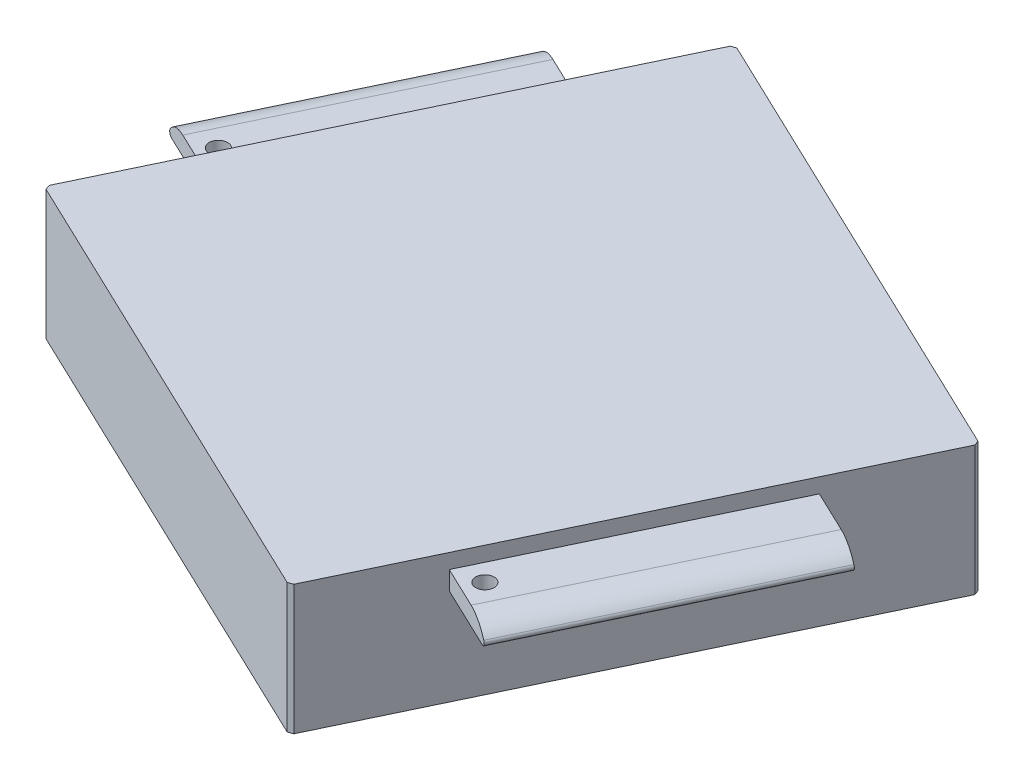
ISO-10303-21;
HEADER;
FILE_DESCRIPTION(('STEP AP214'),'2;1');
FILE_NAME('part.step','',(''),(''),'','','');
FILE_SCHEMA(('AUTOMOTIVE_DESIGN { 1 0 10303 214 1 1 1 1 }'));
ENDSEC;
DATA;
#1=APPLICATION_CONTEXT('core data for automotive mechanical design processes');
#2=APPLICATION_PROTOCOL_DEFINITION('international standard','automotive_design',2000,#1);
#3=PRODUCT_CONTEXT('',#1,'mechanical');
#4=PRODUCT('Part','Part','',(#3));
#5=PRODUCT_RELATED_PRODUCT_CATEGORY('part','',(#4));
#6=PRODUCT_DEFINITION_FORMATION('','',#4);
#7=PRODUCT_DEFINITION_CONTEXT('part definition',#1,'design');
#8=PRODUCT_DEFINITION('design','',#6,#7);
#9=PRODUCT_DEFINITION_SHAPE('','',#8);
#10=(LENGTH_UNIT() NAMED_UNIT(*) SI_UNIT(.MILLI.,.METRE.));
#11=(NAMED_UNIT(*) PLANE_ANGLE_UNIT() SI_UNIT($,.RADIAN.));
#12=(NAMED_UNIT(*) SI_UNIT($,.STERADIAN.) SOLID_ANGLE_UNIT());
#13=UNCERTAINTY_MEASURE_WITH_UNIT(LENGTH_MEASURE(1.E-05),#10,'distance_accuracy_value','');
#14=(GEOMETRIC_REPRESENTATION_CONTEXT(3) GLOBAL_UNCERTAINTY_ASSIGNED_CONTEXT((#13)) GLOBAL_UNIT_ASSIGNED_CONTEXT((#10,
#11,#12)) REPRESENTATION_CONTEXT('',''));
#15=CARTESIAN_POINT('',(0.,0.,0.));
#16=DIRECTION('',(0.,0.,1.));
#17=DIRECTION('',(1.,0.,0.));
#18=AXIS2_PLACEMENT_3D('',#15,#16,#17);
#19=CARTESIAN_POINT('',(29.8578123017319,940.,-1811.82868703004));
#20=DIRECTION('',(-0.902585284349861,0.,-0.430511096808295));
#21=DIRECTION('',(-0.430511096808295,0.,0.902585284349861));
#22=AXIS2_PLACEMENT_3D('',#19,#20,#21);
#23=PLANE('',#22);
#24=DIRECTION('',(0.430511096808295,0.,-0.902585284349861));
#25=VECTOR('',#24,1.);
#26=CARTESIAN_POINT('',(29.8578123017319,870.,-1811.82868703004));
#27=LINE('',#26,#25);
#28=CARTESIAN_POINT('',(29.8578123017319,870.,-1811.82868703004));
#29=VERTEX_POINT('',#28);
#30=CARTESIAN_POINT('',(148.678875020821,870.,-2060.9422255106));
#31=VERTEX_POINT('',#30);
#32=EDGE_CURVE('E235',#29,#31,#27,.T.);
#33=ORIENTED_EDGE('',*,*,#32,.F.);
#34=DIRECTION('',(0.,-1.,0.));
#35=VECTOR('',#34,1.);
#36=CARTESIAN_POINT('',(29.8578123017319,940.,-1811.82868703004));
#37=LINE('',#36,#35);
#38=CARTESIAN_POINT('',(29.8578123017319,940.,-1811.82868703004));
#39=VERTEX_POINT('',#38);
#40=EDGE_CURVE('E11',#39,#29,#37,.T.);
#41=ORIENTED_EDGE('',*,*,#40,.F.);
#42=DIRECTION('',(0.430511096808295,0.,-0.902585284349861));
#43=VECTOR('',#42,1.);
#44=CARTESIAN_POINT('',(29.8578123017319,940.,-1811.82868703004));
#45=LINE('',#44,#43);
#46=CARTESIAN_POINT('',(148.678875020821,940.,-2060.9422255106));
#47=VERTEX_POINT('',#46);
#48=EDGE_CURVE('E259',#39,#47,#45,.T.);
#49=ORIENTED_EDGE('',*,*,#48,.T.);
#50=DIRECTION('',(0.,-1.,0.));
#51=VECTOR('',#50,1.);
#52=CARTESIAN_POINT('',(148.678875020821,940.,-2060.9422255106));
#53=LINE('',#52,#51);
#54=EDGE_CURVE('E25',#47,#31,#53,.T.);
#55=ORIENTED_EDGE('',*,*,#54,.T.);
#56=EDGE_LOOP('',(#33,#41,#49,#55));
#57=FACE_BOUND('',#56,.T.);
#58=DIRECTION('',(0.430511096808295,0.,-0.90258528434986));
#59=VECTOR('',#58,1.);
#60=CARTESIAN_POINT('',(56.9800114006546,932.,-1868.69155994407));
#61=LINE('',#60,#59);
#62=CARTESIAN_POINT('',(56.9800114006546,932.,-1868.69155994407));
#63=VERTEX_POINT('',#62);
#64=CARTESIAN_POINT('',(121.556675921899,932.,-2004.07935259656));
#65=VERTEX_POINT('',#64);
#66=EDGE_CURVE('E32',#63,#65,#61,.T.);
#67=ORIENTED_EDGE('',*,*,#66,.F.);
#68=DIRECTION('',(0.,-1.,0.));
#69=VECTOR('',#68,1.);
#70=CARTESIAN_POINT('',(56.9800114006546,932.,-1868.69155994407));
#71=LINE('',#70,#69);
#72=CARTESIAN_POINT('',(56.9800114006546,922.,-1868.69155994407));
#73=VERTEX_POINT('',#72);
#74=EDGE_CURVE('E36',#63,#73,#71,.T.);
#75=ORIENTED_EDGE('',*,*,#74,.T.);
#76=DIRECTION('',(0.430511096808295,0.,-0.90258528434986));
#77=VECTOR('',#76,1.);
#78=CARTESIAN_POINT('',(56.9800114006546,922.,-1868.69155994407));
#79=LINE('',#78,#77);
#80=CARTESIAN_POINT('',(121.556675921899,922.,-2004.07935259656));
#81=VERTEX_POINT('',#80);
#82=EDGE_CURVE('E136',#73,#81,#79,.T.);
#83=ORIENTED_EDGE('',*,*,#82,.T.);
#84=DIRECTION('',(0.,-1.,0.));
#85=VECTOR('',#84,1.);
#86=CARTESIAN_POINT('',(121.556675921899,932.,-2004.07935259656));
#87=LINE('',#86,#85);
#88=EDGE_CURVE('E139',#65,#81,#87,.T.);
#89=ORIENTED_EDGE('',*,*,#88,.F.);
#90=EDGE_LOOP('',(#67,#75,#83,#89));
#91=FACE_BOUND('',#90,.T.);
#92=ADVANCED_FACE('F17',(#57,#91),#23,.T.);
#93=CARTESIAN_POINT('',(30.8019606768151,940.,-1809.16249426771));
#94=DIRECTION('',(-0.942641491092178,0.,0.333806859233771));
#95=DIRECTION('',(0.333806859233771,0.,0.942641491092178));
#96=AXIS2_PLACEMENT_3D('',#93,#94,#95);
#97=PLANE('',#96);
#98=DIRECTION('',(-0.333806859233771,0.,-0.942641491092178));
#99=VECTOR('',#98,1.);
#100=CARTESIAN_POINT('',(30.8019606768151,870.,-1809.16249426771));
#101=LINE('',#100,#99);
#102=CARTESIAN_POINT('',(30.8019606768151,870.,-1809.16249426771));
#103=VERTEX_POINT('',#102);
#104=EDGE_CURVE('E232',#103,#29,#101,.T.);
#105=ORIENTED_EDGE('',*,*,#104,.F.);
#106=DIRECTION('',(0.,-1.,0.));
#107=VECTOR('',#106,1.);
#108=CARTESIAN_POINT('',(30.8019606768151,940.,-1809.16249426771));
#109=LINE('',#108,#107);
#110=CARTESIAN_POINT('',(30.8019606768151,940.,-1809.16249426771));
#111=VERTEX_POINT('',#110);
#112=EDGE_CURVE('E280',#111,#103,#109,.T.);
#113=ORIENTED_EDGE('',*,*,#112,.F.);
#114=DIRECTION('',(-0.333806859233771,0.,-0.942641491092178));
#115=VECTOR('',#114,1.);
#116=CARTESIAN_POINT('',(30.8019606768151,940.,-1809.16249426771));
#117=LINE('',#116,#115);
#118=EDGE_CURVE('E256',#111,#39,#117,.T.);
#119=ORIENTED_EDGE('',*,*,#118,.T.);
#120=ORIENTED_EDGE('',*,*,#40,.T.);
#121=EDGE_LOOP('',(#105,#113,#119,#120));
#122=FACE_BOUND('',#121,.T.);
#123=ADVANCED_FACE('F19',(#122),#97,.T.);
#124=CARTESIAN_POINT('',(148.678875020821,940.,-2060.9422255106));
#125=DIRECTION('',(-0.333806859233771,0.,-0.942641491092178));
#126=DIRECTION('',(-0.942641491092178,0.,0.333806859233771));
#127=AXIS2_PLACEMENT_3D('',#124,#125,#126);
#128=PLANE('',#127);
#129=DIRECTION('',(0.942641491092178,0.,-0.333806859233771));
#130=VECTOR('',#129,1.);
#131=CARTESIAN_POINT('',(148.678875020821,870.,-2060.9422255106));
#132=LINE('',#131,#130);
#133=CARTESIAN_POINT('',(151.345067783137,870.,-2061.88637388568));
#134=VERTEX_POINT('',#133);
#135=EDGE_CURVE('E238',#31,#134,#132,.T.);
#136=ORIENTED_EDGE('',*,*,#135,.F.);
#137=ORIENTED_EDGE('',*,*,#54,.F.);
#138=DIRECTION('',(0.942641491092178,0.,-0.333806859233771));
#139=VECTOR('',#138,1.);
#140=CARTESIAN_POINT('',(148.678875020821,940.,-2060.9422255106));
#141=LINE('',#140,#139);
#142=CARTESIAN_POINT('',(151.345067783137,940.,-2061.88637388568));
#143=VERTEX_POINT('',#142);
#144=EDGE_CURVE('E262',#47,#143,#141,.T.);
#145=ORIENTED_EDGE('',*,*,#144,.T.);
#146=DIRECTION('',(0.,-1.,0.));
#147=VECTOR('',#146,1.);
#148=CARTESIAN_POINT('',(151.345067783137,940.,-2061.88637388568));
#149=LINE('',#148,#147);
#150=EDGE_CURVE('E292',#143,#134,#149,.T.);
#151=ORIENTED_EDGE('',*,*,#150,.T.);
#152=EDGE_LOOP('',(#136,#137,#145,#151));
#153=FACE_BOUND('',#152,.T.);
#154=ADVANCED_FACE('F299',(#153),#128,.T.);
#155=CARTESIAN_POINT('',(151.345067783137,940.,-2061.88637388568));
#156=DIRECTION('',(0.430511096808295,0.,-0.902585284349861));
#157=DIRECTION('',(-0.902585284349861,0.,-0.430511096808295));
#158=AXIS2_PLACEMENT_3D('',#155,#156,#157);
#159=PLANE('',#158);
#160=DIRECTION('',(0.902585284349861,0.,0.430511096808295));
#161=VECTOR('',#160,1.);
#162=CARTESIAN_POINT('',(151.345067783137,870.,-2061.88637388568));
#163=LINE('',#162,#161);
#164=CARTESIAN_POINT('',(400.458606263699,870.,-1943.06531116659));
#165=VERTEX_POINT('',#164);
#166=EDGE_CURVE('E241',#134,#165,#163,.T.);
#167=ORIENTED_EDGE('',*,*,#166,.F.);
#168=ORIENTED_EDGE('',*,*,#150,.F.);
#169=DIRECTION('',(0.902585284349861,0.,0.430511096808295));
#170=VECTOR('',#169,1.);
#171=CARTESIAN_POINT('',(151.345067783137,940.,-2061.88637388568));
#172=LINE('',#171,#170);
#173=CARTESIAN_POINT('',(400.458606263699,940.,-1943.06531116659));
#174=VERTEX_POINT('',#173);
#175=EDGE_CURVE('E265',#143,#174,#172,.T.);
#176=ORIENTED_EDGE('',*,*,#175,.T.);
#177=DIRECTION('',(0.,-1.,0.));
#178=VECTOR('',#177,1.);
#179=CARTESIAN_POINT('',(400.458606263699,940.,-1943.06531116659));
#180=LINE('',#179,#178);
#181=EDGE_CURVE('E290',#174,#165,#180,.T.);
#182=ORIENTED_EDGE('',*,*,#181,.T.);
#183=EDGE_LOOP('',(#167,#168,#176,#182));
#184=FACE_BOUND('',#183,.T.);
#185=ADVANCED_FACE('F314',(#184),#159,.T.);
#186=CARTESIAN_POINT('',(400.458606263699,940.,-1943.06531116659));
#187=DIRECTION('',(0.942641491092178,0.,-0.333806859233771));
#188=DIRECTION('',(-0.333806859233771,0.,-0.942641491092178));
#189=AXIS2_PLACEMENT_3D('',#186,#187,#188);
#190=PLANE('',#189);
#191=DIRECTION('',(0.333806859233771,0.,0.942641491092178));
#192=VECTOR('',#191,1.);
#193=CARTESIAN_POINT('',(400.458606263699,870.,-1943.06531116659));
#194=LINE('',#193,#192);
#195=CARTESIAN_POINT('',(401.402754638782,870.,-1940.39911840427));
#196=VERTEX_POINT('',#195);
#197=EDGE_CURVE('E244',#165,#196,#194,.T.);
#198=ORIENTED_EDGE('',*,*,#197,.F.);
#199=ORIENTED_EDGE('',*,*,#181,.F.);
#200=DIRECTION('',(0.333806859233771,0.,0.942641491092178));
#201=VECTOR('',#200,1.);
#202=CARTESIAN_POINT('',(400.458606263699,940.,-1943.06531116659));
#203=LINE('',#202,#201);
#204=CARTESIAN_POINT('',(401.402754638782,940.,-1940.39911840427));
#205=VERTEX_POINT('',#204);
#206=EDGE_CURVE('E268',#174,#205,#203,.T.);
#207=ORIENTED_EDGE('',*,*,#206,.T.);
#208=DIRECTION('',(0.,-1.,0.));
#209=VECTOR('',#208,1.);
#210=CARTESIAN_POINT('',(401.402754638782,940.,-1940.39911840427));
#211=LINE('',#210,#209);
#212=EDGE_CURVE('E288',#205,#196,#211,.T.);
#213=ORIENTED_EDGE('',*,*,#212,.T.);
#214=EDGE_LOOP('',(#198,#199,#207,#213));
#215=FACE_BOUND('',#214,.T.);
#216=ADVANCED_FACE('F318',(#215),#190,.T.);
#217=CARTESIAN_POINT('',(401.402754638782,940.,-1940.39911840427));
#218=DIRECTION('',(0.902585284349861,0.,0.430511096808295));
#219=DIRECTION('',(0.430511096808295,0.,-0.902585284349861));
#220=AXIS2_PLACEMENT_3D('',#217,#218,#219);
#221=PLANE('',#220);
#222=DIRECTION('',(0.,-1.,0.));
#223=VECTOR('',#222,1.);
#224=CARTESIAN_POINT('',(309.703891018615,932.,-1748.14845283775));
#225=LINE('',#224,#223);
#226=CARTESIAN_POINT('',(309.703891018615,932.,-1748.14845283775));
#227=VERTEX_POINT('',#226);
#228=CARTESIAN_POINT('',(309.703891018615,922.,-1748.14845283775));
#229=VERTEX_POINT('',#228);
#230=EDGE_CURVE('E205',#227,#229,#225,.T.);
#231=ORIENTED_EDGE('',*,*,#230,.F.);
#232=DIRECTION('',(0.430511096808295,0.,-0.902585284349861));
#233=VECTOR('',#232,1.);
#234=CARTESIAN_POINT('',(309.703891018615,932.,-1748.14845283775));
#235=LINE('',#234,#233);
#236=CARTESIAN_POINT('',(374.28055553986,932.,-1883.53624549023));
#237=VERTEX_POINT('',#236);
#238=EDGE_CURVE('E230',#227,#237,#235,.T.);
#239=ORIENTED_EDGE('',*,*,#238,.T.);
#240=DIRECTION('',(0.,-1.,0.));
#241=VECTOR('',#240,1.);
#242=CARTESIAN_POINT('',(374.28055553986,932.,-1883.53624549023));
#243=LINE('',#242,#241);
#244=CARTESIAN_POINT('',(374.28055553986,922.,-1883.53624549023));
#245=VERTEX_POINT('',#244);
#246=EDGE_CURVE('E191',#237,#245,#243,.T.);
#247=ORIENTED_EDGE('',*,*,#246,.T.);
#248=DIRECTION('',(0.430511096808295,0.,-0.902585284349861));
#249=VECTOR('',#248,1.);
#250=CARTESIAN_POINT('',(309.703891018615,922.,-1748.14845283775));
#251=LINE('',#250,#249);
#252=EDGE_CURVE('E227',#229,#245,#251,.T.);
#253=ORIENTED_EDGE('',*,*,#252,.F.);
#254=EDGE_LOOP('',(#231,#239,#247,#253));
#255=FACE_BOUND('',#254,.T.);
#256=DIRECTION('',(-0.430511096808295,0.,0.902585284349861));
#257=VECTOR('',#256,1.);
#258=CARTESIAN_POINT('',(401.402754638782,870.,-1940.39911840427));
#259=LINE('',#258,#257);
#260=CARTESIAN_POINT('',(282.581691919693,870.,-1691.28557992371));
#261=VERTEX_POINT('',#260);
#262=EDGE_CURVE('E247',#196,#261,#259,.T.);
#263=ORIENTED_EDGE('',*,*,#262,.F.);
#264=ORIENTED_EDGE('',*,*,#212,.F.);
#265=DIRECTION('',(-0.430511096808295,0.,0.902585284349861));
#266=VECTOR('',#265,1.);
#267=CARTESIAN_POINT('',(401.402754638782,940.,-1940.39911840427));
#268=LINE('',#267,#266);
#269=CARTESIAN_POINT('',(282.581691919693,940.,-1691.28557992371));
#270=VERTEX_POINT('',#269);
#271=EDGE_CURVE('E271',#205,#270,#268,.T.);
#272=ORIENTED_EDGE('',*,*,#271,.T.);
#273=DIRECTION('',(0.,-1.,0.));
#274=VECTOR('',#273,1.);
#275=CARTESIAN_POINT('',(282.581691919693,940.,-1691.28557992371));
#276=LINE('',#275,#274);
#277=EDGE_CURVE('E286',#270,#261,#276,.T.);
#278=ORIENTED_EDGE('',*,*,#277,.T.);
#279=EDGE_LOOP('',(#263,#264,#272,#278));
#280=FACE_BOUND('',#279,.T.);
#281=ADVANCED_FACE('F320',(#255,#280),#221,.T.);
#282=CARTESIAN_POINT('',(282.581691919693,940.,-1691.28557992371));
#283=DIRECTION('',(0.333806859233771,0.,0.942641491092178));
#284=DIRECTION('',(0.942641491092178,0.,-0.333806859233771));
#285=AXIS2_PLACEMENT_3D('',#282,#283,#284);
#286=PLANE('',#285);
#287=DIRECTION('',(-0.942641491092178,0.,0.333806859233771));
#288=VECTOR('',#287,1.);
#289=CARTESIAN_POINT('',(282.581691919693,870.,-1691.28557992371));
#290=LINE('',#289,#288);
#291=CARTESIAN_POINT('',(279.915499157377,870.,-1690.34143154862));
#292=VERTEX_POINT('',#291);
#293=EDGE_CURVE('E250',#261,#292,#290,.T.);
#294=ORIENTED_EDGE('',*,*,#293,.F.);
#295=ORIENTED_EDGE('',*,*,#277,.F.);
#296=DIRECTION('',(-0.942641491092178,0.,0.333806859233771));
#297=VECTOR('',#296,1.);
#298=CARTESIAN_POINT('',(282.581691919693,940.,-1691.28557992371));
#299=LINE('',#298,#297);
#300=CARTESIAN_POINT('',(279.915499157377,940.,-1690.34143154862));
#301=VERTEX_POINT('',#300);
#302=EDGE_CURVE('E274',#270,#301,#299,.T.);
#303=ORIENTED_EDGE('',*,*,#302,.T.);
#304=DIRECTION('',(0.,-1.,0.));
#305=VECTOR('',#304,1.);
#306=CARTESIAN_POINT('',(279.915499157377,940.,-1690.34143154862));
#307=LINE('',#306,#305);
#308=EDGE_CURVE('E284',#301,#292,#307,.T.);
#309=ORIENTED_EDGE('',*,*,#308,.T.);
#310=EDGE_LOOP('',(#294,#295,#303,#309));
#311=FACE_BOUND('',#310,.T.);
#312=ADVANCED_FACE('F324',(#311),#286,.T.);
#313=CARTESIAN_POINT('',(279.915499157377,940.,-1690.34143154862));
#314=DIRECTION('',(-0.430511096808295,0.,0.902585284349861));
#315=DIRECTION('',(0.902585284349861,0.,0.430511096808295));
#316=AXIS2_PLACEMENT_3D('',#313,#314,#315);
#317=PLANE('',#316);
#318=DIRECTION('',(-0.902585284349861,0.,-0.430511096808295));
#319=VECTOR('',#318,1.);
#320=CARTESIAN_POINT('',(279.915499157377,870.,-1690.34143154862));
#321=LINE('',#320,#319);
#322=EDGE_CURVE('E253',#292,#103,#321,.T.);
#323=ORIENTED_EDGE('',*,*,#322,.F.);
#324=ORIENTED_EDGE('',*,*,#308,.F.);
#325=DIRECTION('',(-0.902585284349861,0.,-0.430511096808295));
#326=VECTOR('',#325,1.);
#327=CARTESIAN_POINT('',(279.915499157377,940.,-1690.34143154862));
#328=LINE('',#327,#326);
#329=EDGE_CURVE('E277',#301,#111,#328,.T.);
#330=ORIENTED_EDGE('',*,*,#329,.T.);
#331=ORIENTED_EDGE('',*,*,#112,.T.);
#332=EDGE_LOOP('',(#323,#324,#330,#331));
#333=FACE_BOUND('',#332,.T.);
#334=ADVANCED_FACE('F326',(#333),#317,.T.);
#335=CARTESIAN_POINT('',(-35.2884255790041,940.,-1995.79598762986));
#336=DIRECTION('',(0.,-1.,0.));
#337=DIRECTION('',(-0.902585284349861,0.,-0.430511096808295));
#338=AXIS2_PLACEMENT_3D('',#335,#336,#337);
#339=PLANE('',#338);
#340=ORIENTED_EDGE('',*,*,#118,.F.);
#341=ORIENTED_EDGE('',*,*,#329,.F.);
#342=ORIENTED_EDGE('',*,*,#302,.F.);
#343=ORIENTED_EDGE('',*,*,#271,.F.);
#344=ORIENTED_EDGE('',*,*,#206,.F.);
#345=ORIENTED_EDGE('',*,*,#175,.F.);
#346=ORIENTED_EDGE('',*,*,#144,.F.);
#347=ORIENTED_EDGE('',*,*,#48,.F.);
#348=EDGE_LOOP('',(#340,#341,#342,#343,#344,#345,#346,#347));
#349=FACE_BOUND('',#348,.T.);
#350=ADVANCED_FACE('F308',(#349),#339,.F.);
#351=CARTESIAN_POINT('',(-35.2884255790041,870.,-1995.79598762986));
#352=DIRECTION('',(0.,-1.,0.));
#353=DIRECTION('',(-0.902585284349861,0.,-0.430511096808295));
#354=AXIS2_PLACEMENT_3D('',#351,#352,#353);
#355=PLANE('',#354);
#356=ORIENTED_EDGE('',*,*,#104,.T.);
#357=ORIENTED_EDGE('',*,*,#32,.T.);
#358=ORIENTED_EDGE('',*,*,#135,.T.);
#359=ORIENTED_EDGE('',*,*,#166,.T.);
#360=ORIENTED_EDGE('',*,*,#197,.T.);
#361=ORIENTED_EDGE('',*,*,#262,.T.);
#362=ORIENTED_EDGE('',*,*,#293,.T.);
#363=ORIENTED_EDGE('',*,*,#322,.T.);
#364=EDGE_LOOP('',(#356,#357,#358,#359,#360,#361,#362,#363));
#365=FACE_BOUND('',#364,.T.);
#366=ADVANCED_FACE('F302',(#365),#355,.T.);
#367=CARTESIAN_POINT('',(332.26852312736,932.,-1737.38567541755));
#368=DIRECTION('',(0.,1.,0.));
#369=DIRECTION('',(0.902585284349861,0.,0.430511096808295));
#370=AXIS2_PLACEMENT_3D('',#367,#368,#369);
#371=PLANE('',#370);
#372=CARTESIAN_POINT('',(325.291318041071,932.,-1751.79291697115));
#373=DIRECTION('',(0.,1.,0.));
#374=DIRECTION('',(0.902585284349861,0.,0.430511096808295));
#375=AXIS2_PLACEMENT_3D('',#372,#373,#374);
#376=CIRCLE('',#375,5.);
#377=CARTESIAN_POINT('',(329.804244462821,932.,-1749.6403614871));
#378=VERTEX_POINT('',#377);
#379=EDGE_CURVE('E185',#378,#378,#376,.T.);
#380=ORIENTED_EDGE('',*,*,#379,.F.);
#381=EDGE_LOOP('',(#380));
#382=FACE_BOUND('',#381,.T.);
#383=DIRECTION('',(-0.902585284349861,0.,-0.430511096808295));
#384=VECTOR('',#383,1.);
#385=CARTESIAN_POINT('',(396.845187648604,932.,-1872.77346807003));
#386=LINE('',#385,#384);
#387=CARTESIAN_POINT('',(396.845187648604,932.,-1872.77346807003));
#388=VERTEX_POINT('',#387);
#389=EDGE_CURVE('E194',#388,#237,#386,.T.);
#390=ORIENTED_EDGE('',*,*,#389,.T.);
#391=ORIENTED_EDGE('',*,*,#238,.F.);
#392=DIRECTION('',(-0.902585284349861,0.,-0.430511096808295));
#393=VECTOR('',#392,1.);
#394=CARTESIAN_POINT('',(332.26852312736,932.,-1737.38567541755));
#395=LINE('',#394,#393);
#396=CARTESIAN_POINT('',(332.26852312736,932.,-1737.38567541755));
#397=VERTEX_POINT('',#396);
#398=EDGE_CURVE('E202',#397,#227,#395,.T.);
#399=ORIENTED_EDGE('',*,*,#398,.F.);
#400=DIRECTION('',(0.430511096808295,0.,-0.902585284349861));
#401=VECTOR('',#400,1.);
#402=CARTESIAN_POINT('',(332.26852312736,932.,-1737.38567541755));
#403=LINE('',#402,#401);
#404=EDGE_CURVE('E216',#397,#388,#403,.T.);
#405=ORIENTED_EDGE('',*,*,#404,.T.);
#406=EDGE_LOOP('',(#390,#391,#399,#405));
#407=FACE_BOUND('',#406,.T.);
#408=ADVANCED_FACE('F359',(#382,#407),#371,.T.);
#409=CARTESIAN_POINT('',(309.703891018615,922.,-1748.14845283775));
#410=DIRECTION('',(0.,-1.,0.));
#411=DIRECTION('',(-0.902585284349861,0.,-0.430511096808295));
#412=AXIS2_PLACEMENT_3D('',#409,#410,#411);
#413=PLANE('',#412);
#414=CARTESIAN_POINT('',(325.291318041071,922.,-1751.79291697115));
#415=DIRECTION('',(0.,1.,0.));
#416=DIRECTION('',(-0.902585284349861,0.,-0.430511096808295));
#417=AXIS2_PLACEMENT_3D('',#414,#415,#416);
#418=CIRCLE('',#417,5.);
#419=CARTESIAN_POINT('',(320.778391619322,922.,-1753.94547245519));
#420=VERTEX_POINT('',#419);
#421=EDGE_CURVE('E190',#420,#420,#418,.T.);
#422=ORIENTED_EDGE('',*,*,#421,.T.);
#423=EDGE_LOOP('',(#422));
#424=FACE_BOUND('',#423,.T.);
#425=DIRECTION('',(0.902585284349861,0.,0.430511096808295));
#426=VECTOR('',#425,1.);
#427=CARTESIAN_POINT('',(374.28055553986,922.,-1883.53624549023));
#428=LINE('',#427,#426);
#429=CARTESIAN_POINT('',(408.578796345155,922.,-1867.17682381152));
#430=VERTEX_POINT('',#429);
#431=EDGE_CURVE('E193',#245,#430,#428,.T.);
#432=ORIENTED_EDGE('',*,*,#431,.T.);
#433=DIRECTION('',(0.430511096808295,0.,-0.902585284349861));
#434=VECTOR('',#433,1.);
#435=CARTESIAN_POINT('',(344.00213182391,922.,-1731.78903115903));
#436=LINE('',#435,#434);
#437=CARTESIAN_POINT('',(344.00213182391,922.,-1731.78903115903));
#438=VERTEX_POINT('',#437);
#439=EDGE_CURVE('E224',#438,#430,#436,.T.);
#440=ORIENTED_EDGE('',*,*,#439,.F.);
#441=DIRECTION('',(0.902585284349861,0.,0.430511096808295));
#442=VECTOR('',#441,1.);
#443=CARTESIAN_POINT('',(309.703891018615,922.,-1748.14845283775));
#444=LINE('',#443,#442);
#445=EDGE_CURVE('E208',#229,#438,#444,.T.);
#446=ORIENTED_EDGE('',*,*,#445,.F.);
#447=ORIENTED_EDGE('',*,*,#252,.T.);
#448=EDGE_LOOP('',(#432,#440,#446,#447));
#449=FACE_BOUND('',#448,.T.);
#450=ADVANCED_FACE('F366',(#424,#449),#413,.T.);
#451=CARTESIAN_POINT('',(344.00213182391,924.,-1731.78903115903));
#452=DIRECTION('',(0.430511096808295,0.,-0.902585284349861));
#453=DIRECTION('',(-0.902585284349861,0.,-0.430511096808295));
#454=AXIS2_PLACEMENT_3D('',#451,#452,#453);
#455=CYLINDRICAL_SURFACE('',#454,2.);
#456=CARTESIAN_POINT('',(408.578796345155,924.,-1867.17682381152));
#457=DIRECTION('',(-0.430511096808295,0.,0.902585284349861));
#458=DIRECTION('',(0.,-1.,0.));
#459=AXIS2_PLACEMENT_3D('',#456,#457,#458);
#460=CIRCLE('',#459,2.);
#461=CARTESIAN_POINT('',(409.955134254388,925.294113061495,-1866.52034430409));
#462=VERTEX_POINT('',#461);
#463=EDGE_CURVE('E197',#430,#462,#460,.T.);
#464=ORIENTED_EDGE('',*,*,#463,.T.);
#465=DIRECTION('',(0.430511096808295,0.,-0.902585284349861));
#466=VECTOR('',#465,1.);
#467=CARTESIAN_POINT('',(345.378469733144,925.294113061495,-1731.1325516516));
#468=LINE('',#467,#466);
#469=CARTESIAN_POINT('',(345.378469733144,925.294113061495,-1731.1325516516));
#470=VERTEX_POINT('',#469);
#471=EDGE_CURVE('E221',#470,#462,#468,.T.);
#472=ORIENTED_EDGE('',*,*,#471,.F.);
#473=CARTESIAN_POINT('',(344.00213182391,924.,-1731.78903115903));
#474=DIRECTION('',(-0.430511096808295,0.,0.902585284349861));
#475=DIRECTION('',(0.,-1.,0.));
#476=AXIS2_PLACEMENT_3D('',#473,#474,#475);
#477=CIRCLE('',#476,2.);
#478=EDGE_CURVE('E211',#438,#470,#477,.T.);
#479=ORIENTED_EDGE('',*,*,#478,.F.);
#480=ORIENTED_EDGE('',*,*,#439,.T.);
#481=EDGE_LOOP('',(#464,#472,#479,#480));
#482=FACE_BOUND('',#481,.T.);
#483=ADVANCED_FACE('F369',(#482),#455,.T.);
#484=CARTESIAN_POINT('',(332.303259595426,913.000038977292,-1737.36910697219));
#485=DIRECTION('',(0.430511096808295,0.,-0.902585284349861));
#486=DIRECTION('',(-0.902585284349861,0.,-0.430511096808295));
#487=AXIS2_PLACEMENT_3D('',#484,#485,#486);
#488=CYLINDRICAL_SURFACE('',#487,19.);
#489=CARTESIAN_POINT('',(396.879924116669,913.000038977292,-1872.75689962467));
#490=DIRECTION('',(-0.430511096808296,0.,0.902585284349861));
#491=DIRECTION('',(-0.00182823516121589,0.999997948563554,-0.000872023439917225));
#492=AXIS2_PLACEMENT_3D('',#489,#490,#491);
#493=CIRCLE('',#492,19.);
#494=EDGE_CURVE('E200',#462,#388,#493,.T.);
#495=ORIENTED_EDGE('',*,*,#494,.T.);
#496=ORIENTED_EDGE('',*,*,#404,.F.);
#497=CARTESIAN_POINT('',(332.303259595426,913.000038977292,-1737.36910697219));
#498=DIRECTION('',(-0.430511096808296,0.,0.902585284349861));
#499=DIRECTION('',(-0.00182823516121589,0.999997948563554,-0.000872023439917225));
#500=AXIS2_PLACEMENT_3D('',#497,#498,#499);
#501=CIRCLE('',#500,19.);
#502=EDGE_CURVE('E214',#470,#397,#501,.T.);
#503=ORIENTED_EDGE('',*,*,#502,.F.);
#504=ORIENTED_EDGE('',*,*,#471,.T.);
#505=EDGE_LOOP('',(#495,#496,#503,#504));
#506=FACE_BOUND('',#505,.T.);
#507=ADVANCED_FACE('F371',(#506),#488,.T.);
#508=CARTESIAN_POINT('',(344.00213182391,924.,-1731.78903115903));
#509=DIRECTION('',(0.430511096808295,0.,-0.902585284349861));
#510=DIRECTION('',(-0.902585284349861,0.,-0.430511096808295));
#511=AXIS2_PLACEMENT_3D('',#508,#509,#510);
#512=PLANE('',#511);
#513=ORIENTED_EDGE('',*,*,#398,.T.);
#514=ORIENTED_EDGE('',*,*,#230,.T.);
#515=ORIENTED_EDGE('',*,*,#445,.T.);
#516=ORIENTED_EDGE('',*,*,#478,.T.);
#517=ORIENTED_EDGE('',*,*,#502,.T.);
#518=EDGE_LOOP('',(#513,#514,#515,#516,#517));
#519=FACE_BOUND('',#518,.T.);
#520=ADVANCED_FACE('F356',(#519),#512,.F.);
#521=CARTESIAN_POINT('',(408.578796345155,924.,-1867.17682381152));
#522=DIRECTION('',(0.430511096808295,0.,-0.902585284349861));
#523=DIRECTION('',(-0.902585284349861,0.,-0.430511096808295));
#524=AXIS2_PLACEMENT_3D('',#521,#522,#523);
#525=PLANE('',#524);
#526=ORIENTED_EDGE('',*,*,#389,.F.);
#527=ORIENTED_EDGE('',*,*,#494,.F.);
#528=ORIENTED_EDGE('',*,*,#463,.F.);
#529=ORIENTED_EDGE('',*,*,#431,.F.);
#530=ORIENTED_EDGE('',*,*,#246,.F.);
#531=EDGE_LOOP('',(#526,#527,#528,#529,#530));
#532=FACE_BOUND('',#531,.T.);
#533=ADVANCED_FACE('F362',(#532),#525,.T.);
#534=CARTESIAN_POINT('',(325.291318041071,916.999999999951,-1751.79291697115));
#535=DIRECTION('',(0.,1.,0.));
#536=DIRECTION('',(0.902585284349861,0.,0.430511096808295));
#537=AXIS2_PLACEMENT_3D('',#534,#535,#536);
#538=CYLINDRICAL_SURFACE('',#537,5.);
#539=ORIENTED_EDGE('',*,*,#421,.F.);
#540=EDGE_LOOP('',(#539));
#541=FACE_BOUND('',#540,.T.);
#542=ORIENTED_EDGE('',*,*,#379,.T.);
#543=EDGE_LOOP('',(#542));
#544=FACE_BOUND('',#543,.T.);
#545=ADVANCED_FACE('F434',(#541,#544),#538,.F.);
#546=CARTESIAN_POINT('',(34.4153792919104,932.,-1879.45433736428));
#547=DIRECTION('',(0.,1.,0.));
#548=DIRECTION('',(-0.90258528434986,0.,-0.430511096808295));
#549=AXIS2_PLACEMENT_3D('',#546,#547,#548);
#550=PLANE('',#549);
#551=CARTESIAN_POINT('',(50.0028063143644,932.,-1883.09880149768));
#552=DIRECTION('',(0.,-1.,0.));
#553=DIRECTION('',(-0.902585284349861,0.,-0.430511096808295));
#554=AXIS2_PLACEMENT_3D('',#551,#552,#553);
#555=CIRCLE('',#554,5.);
#556=CARTESIAN_POINT('',(45.4898798926151,932.,-1885.25135698172));
#557=VERTEX_POINT('',#556);
#558=EDGE_CURVE('E162',#557,#557,#555,.T.);
#559=ORIENTED_EDGE('',*,*,#558,.T.);
#560=EDGE_LOOP('',(#559));
#561=FACE_BOUND('',#560,.T.);
#562=DIRECTION('',(0.90258528434986,0.,0.430511096808295));
#563=VECTOR('',#562,1.);
#564=CARTESIAN_POINT('',(98.9920438131547,932.,-2014.84213001676));
#565=LINE('',#564,#563);
#566=CARTESIAN_POINT('',(98.9920438131547,932.,-2014.84213001676));
#567=VERTEX_POINT('',#566);
#568=EDGE_CURVE('E157',#567,#65,#565,.T.);
#569=ORIENTED_EDGE('',*,*,#568,.F.);
#570=DIRECTION('',(0.430511096808295,0.,-0.90258528434986));
#571=VECTOR('',#570,1.);
#572=CARTESIAN_POINT('',(34.4153792919105,932.,-1879.45433736428));
#573=LINE('',#572,#571);
#574=CARTESIAN_POINT('',(34.4153792919105,932.,-1879.45433736428));
#575=VERTEX_POINT('',#574);
#576=EDGE_CURVE('E177',#575,#567,#573,.T.);
#577=ORIENTED_EDGE('',*,*,#576,.F.);
#578=DIRECTION('',(0.90258528434986,0.,0.430511096808295));
#579=VECTOR('',#578,1.);
#580=CARTESIAN_POINT('',(34.4153792919104,932.,-1879.45433736428));
#581=LINE('',#580,#579);
#582=EDGE_CURVE('E166',#575,#63,#581,.T.);
#583=ORIENTED_EDGE('',*,*,#582,.T.);
#584=ORIENTED_EDGE('',*,*,#66,.T.);
#585=EDGE_LOOP('',(#569,#577,#583,#584));
#586=FACE_BOUND('',#585,.T.);
#587=ADVANCED_FACE('F442',(#561,#586),#550,.T.);
#588=CARTESIAN_POINT('',(56.9800114006546,922.,-1868.69155994407));
#589=DIRECTION('',(0.,-1.,0.));
#590=DIRECTION('',(0.90258528434986,0.,0.430511096808295));
#591=AXIS2_PLACEMENT_3D('',#588,#589,#590);
#592=PLANE('',#591);
#593=CARTESIAN_POINT('',(50.0028063143644,922.,-1883.09880149768));
#594=DIRECTION('',(0.,-1.,0.));
#595=DIRECTION('',(0.902585284349861,0.,0.430511096808295));
#596=AXIS2_PLACEMENT_3D('',#593,#594,#595);
#597=CIRCLE('',#596,5.);
#598=CARTESIAN_POINT('',(54.5157327361137,922.,-1880.94624601363));
#599=VERTEX_POINT('',#598);
#600=EDGE_CURVE('E159',#599,#599,#597,.T.);
#601=ORIENTED_EDGE('',*,*,#600,.F.);
#602=EDGE_LOOP('',(#601));
#603=FACE_BOUND('',#602,.T.);
#604=DIRECTION('',(-0.90258528434986,0.,-0.430511096808295));
#605=VECTOR('',#604,1.);
#606=CARTESIAN_POINT('',(121.556675921899,922.,-2004.07935259656));
#607=LINE('',#606,#605);
#608=CARTESIAN_POINT('',(87.2584351166041,922.,-2020.43877427527));
#609=VERTEX_POINT('',#608);
#610=EDGE_CURVE('E146',#81,#609,#607,.T.);
#611=ORIENTED_EDGE('',*,*,#610,.F.);
#612=ORIENTED_EDGE('',*,*,#82,.F.);
#613=DIRECTION('',(-0.90258528434986,0.,-0.430511096808295));
#614=VECTOR('',#613,1.);
#615=CARTESIAN_POINT('',(56.9800114006546,922.,-1868.69155994407));
#616=LINE('',#615,#614);
#617=CARTESIAN_POINT('',(22.6817705953598,922.,-1885.05098162279));
#618=VERTEX_POINT('',#617);
#619=EDGE_CURVE('E169',#73,#618,#616,.T.);
#620=ORIENTED_EDGE('',*,*,#619,.T.);
#621=DIRECTION('',(0.430511096808295,0.,-0.90258528434986));
#622=VECTOR('',#621,1.);
#623=CARTESIAN_POINT('',(22.6817705953598,922.,-1885.05098162279));
#624=LINE('',#623,#622);
#625=EDGE_CURVE('E143',#618,#609,#624,.T.);
#626=ORIENTED_EDGE('',*,*,#625,.T.);
#627=EDGE_LOOP('',(#611,#612,#620,#626));
#628=FACE_BOUND('',#627,.T.);
#629=ADVANCED_FACE('F147',(#603,#628),#592,.T.);
#630=CARTESIAN_POINT('',(22.6817705953599,924.,-1885.05098162279));
#631=DIRECTION('',(0.430511096808295,0.,-0.90258528434986));
#632=DIRECTION('',(0.90258528434986,0.,0.430511096808295));
#633=AXIS2_PLACEMENT_3D('',#630,#631,#632);
#634=CYLINDRICAL_SURFACE('',#633,2.);
#635=CARTESIAN_POINT('',(87.2584351166041,924.,-2020.43877427527));
#636=DIRECTION('',(0.430511096808295,0.,-0.90258528434986));
#637=DIRECTION('',(0.,-1.,0.));
#638=AXIS2_PLACEMENT_3D('',#635,#636,#637);
#639=CIRCLE('',#638,2.);
#640=CARTESIAN_POINT('',(85.8820972073706,925.294113061495,-2021.0952537827));
#641=VERTEX_POINT('',#640);
#642=EDGE_CURVE('E151',#609,#641,#639,.T.);
#643=ORIENTED_EDGE('',*,*,#642,.F.);
#644=ORIENTED_EDGE('',*,*,#625,.F.);
#645=CARTESIAN_POINT('',(22.6817705953599,924.,-1885.05098162279));
#646=DIRECTION('',(0.430511096808295,0.,-0.90258528434986));
#647=DIRECTION('',(0.,-1.,0.));
#648=AXIS2_PLACEMENT_3D('',#645,#646,#647);
#649=CIRCLE('',#648,2.);
#650=CARTESIAN_POINT('',(21.3054326861264,925.294113061495,-1885.70746113022));
#651=VERTEX_POINT('',#650);
#652=EDGE_CURVE('E171',#618,#651,#649,.T.);
#653=ORIENTED_EDGE('',*,*,#652,.T.);
#654=DIRECTION('',(0.430511096808295,0.,-0.90258528434986));
#655=VECTOR('',#654,1.);
#656=CARTESIAN_POINT('',(21.3054326861264,925.294113061495,-1885.70746113022));
#657=LINE('',#656,#655);
#658=EDGE_CURVE('E181',#651,#641,#657,.T.);
#659=ORIENTED_EDGE('',*,*,#658,.T.);
#660=EDGE_LOOP('',(#643,#644,#653,#659));
#661=FACE_BOUND('',#660,.T.);
#662=ADVANCED_FACE('F461',(#661),#634,.T.);
#663=CARTESIAN_POINT('',(34.3806428238449,913.000038977292,-1879.47090580964));
#664=DIRECTION('',(0.430511096808295,0.,-0.90258528434986));
#665=DIRECTION('',(0.90258528434986,0.,0.430511096808295));
#666=AXIS2_PLACEMENT_3D('',#663,#664,#665);
#667=CYLINDRICAL_SURFACE('',#666,19.);
#668=CARTESIAN_POINT('',(98.9573073450892,913.000038977292,-2014.85869846212));
#669=DIRECTION('',(0.430511096808295,0.,-0.902585284349861));
#670=DIRECTION('',(0.00182823516121479,0.999997948563554,0.000872023439919164));
#671=AXIS2_PLACEMENT_3D('',#668,#669,#670);
#672=CIRCLE('',#671,19.);
#673=EDGE_CURVE('E165',#641,#567,#672,.T.);
#674=ORIENTED_EDGE('',*,*,#673,.F.);
#675=ORIENTED_EDGE('',*,*,#658,.F.);
#676=CARTESIAN_POINT('',(34.3806428238449,913.000038977292,-1879.47090580964));
#677=DIRECTION('',(0.430511096808295,0.,-0.902585284349861));
#678=DIRECTION('',(0.00182823516121479,0.999997948563554,0.000872023439919164));
#679=AXIS2_PLACEMENT_3D('',#676,#677,#678);
#680=CIRCLE('',#679,19.);
#681=EDGE_CURVE('E174',#651,#575,#680,.T.);
#682=ORIENTED_EDGE('',*,*,#681,.T.);
#683=ORIENTED_EDGE('',*,*,#576,.T.);
#684=EDGE_LOOP('',(#674,#675,#682,#683));
#685=FACE_BOUND('',#684,.T.);
#686=ADVANCED_FACE('F471',(#685),#667,.T.);
#687=CARTESIAN_POINT('',(22.6817705953599,924.,-1885.05098162279));
#688=DIRECTION('',(0.430511096808295,0.,-0.90258528434986));
#689=DIRECTION('',(0.90258528434986,0.,0.430511096808295));
#690=AXIS2_PLACEMENT_3D('',#687,#688,#689);
#691=PLANE('',#690);
#692=ORIENTED_EDGE('',*,*,#582,.F.);
#693=ORIENTED_EDGE('',*,*,#681,.F.);
#694=ORIENTED_EDGE('',*,*,#652,.F.);
#695=ORIENTED_EDGE('',*,*,#619,.F.);
#696=ORIENTED_EDGE('',*,*,#74,.F.);
#697=EDGE_LOOP('',(#692,#693,#694,#695,#696));
#698=FACE_BOUND('',#697,.T.);
#699=ADVANCED_FACE('F481',(#698),#691,.F.);
#700=CARTESIAN_POINT('',(87.2584351166041,924.,-2020.43877427527));
#701=DIRECTION('',(0.430511096808295,0.,-0.90258528434986));
#702=DIRECTION('',(0.90258528434986,0.,0.430511096808295));
#703=AXIS2_PLACEMENT_3D('',#700,#701,#702);
#704=PLANE('',#703);
#705=ORIENTED_EDGE('',*,*,#568,.T.);
#706=ORIENTED_EDGE('',*,*,#88,.T.);
#707=ORIENTED_EDGE('',*,*,#610,.T.);
#708=ORIENTED_EDGE('',*,*,#642,.T.);
#709=ORIENTED_EDGE('',*,*,#673,.T.);
#710=EDGE_LOOP('',(#705,#706,#707,#708,#709));
#711=FACE_BOUND('',#710,.T.);
#712=ADVANCED_FACE('F154',(#711),#704,.T.);
#713=CARTESIAN_POINT('',(50.0028063143644,916.999999999951,-1883.09880149768));
#714=DIRECTION('',(0.,1.,0.));
#715=DIRECTION('',(-0.902585284349861,0.,-0.430511096808295));
#716=AXIS2_PLACEMENT_3D('',#713,#714,#715);
#717=CYLINDRICAL_SURFACE('',#716,5.);
#718=ORIENTED_EDGE('',*,*,#600,.T.);
#719=EDGE_LOOP('',(#718));
#720=FACE_BOUND('',#719,.T.);
#721=ORIENTED_EDGE('',*,*,#558,.F.);
#722=EDGE_LOOP('',(#721));
#723=FACE_BOUND('',#722,.T.);
#724=ADVANCED_FACE('F500',(#720,#723),#717,.F.);
#725=CLOSED_SHELL('',(#92,#123,#154,#185,#216,#281,#312,#334,#350,#366,#408,#450,#483,#507,#520,
#533,#545,#587,#629,#662,#686,#699,#712,#724));
#726=MANIFOLD_SOLID_BREP('B1',#725);
#727=ADVANCED_BREP_SHAPE_REPRESENTATION('',(#18,#726),#14);
#728=SHAPE_DEFINITION_REPRESENTATION(#9,#727);
ENDSEC;
END-ISO-10303-21;
